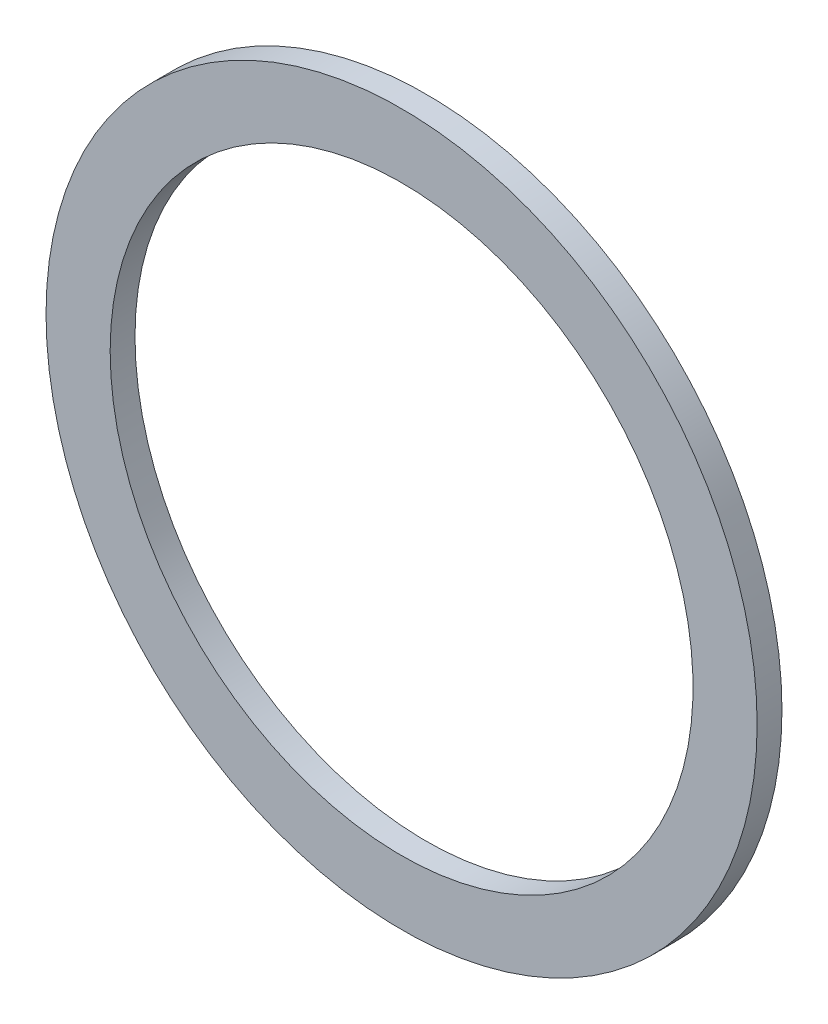
ISO-10303-21;
HEADER;
FILE_DESCRIPTION(('STEP AP214'),'2;1');
FILE_NAME('part.step','',(''),(''),'','','');
FILE_SCHEMA(('AUTOMOTIVE_DESIGN { 1 0 10303 214 1 1 1 1 }'));
ENDSEC;
DATA;
#1=APPLICATION_CONTEXT('core data for automotive mechanical design processes');
#2=APPLICATION_PROTOCOL_DEFINITION('international standard','automotive_design',2000,#1);
#3=PRODUCT_CONTEXT('',#1,'mechanical');
#4=PRODUCT('Part','Part','',(#3));
#5=PRODUCT_RELATED_PRODUCT_CATEGORY('part','',(#4));
#6=PRODUCT_DEFINITION_FORMATION('','',#4);
#7=PRODUCT_DEFINITION_CONTEXT('part definition',#1,'design');
#8=PRODUCT_DEFINITION('design','',#6,#7);
#9=PRODUCT_DEFINITION_SHAPE('','',#8);
#10=(LENGTH_UNIT() NAMED_UNIT(*) SI_UNIT(.MILLI.,.METRE.));
#11=(NAMED_UNIT(*) PLANE_ANGLE_UNIT() SI_UNIT($,.RADIAN.));
#12=(NAMED_UNIT(*) SI_UNIT($,.STERADIAN.) SOLID_ANGLE_UNIT());
#13=UNCERTAINTY_MEASURE_WITH_UNIT(LENGTH_MEASURE(1.E-05),#10,'distance_accuracy_value','');
#14=(GEOMETRIC_REPRESENTATION_CONTEXT(3) GLOBAL_UNCERTAINTY_ASSIGNED_CONTEXT((#13)) GLOBAL_UNIT_ASSIGNED_CONTEXT((#10,
#11,#12)) REPRESENTATION_CONTEXT('',''));
#15=CARTESIAN_POINT('',(0.,0.,0.));
#16=DIRECTION('',(0.,0.,1.));
#17=DIRECTION('',(1.,0.,0.));
#18=AXIS2_PLACEMENT_3D('',#15,#16,#17);
#19=CARTESIAN_POINT('',(0.,0.,0.));
#20=DIRECTION('',(0.,0.,-1.));
#21=DIRECTION('',(-1.,0.,0.));
#22=AXIS2_PLACEMENT_3D('',#19,#20,#21);
#23=PLANE('',#22);
#24=CARTESIAN_POINT('',(0.,0.,0.));
#25=DIRECTION('',(0.,0.,-1.));
#26=DIRECTION('',(-1.,0.,0.));
#27=AXIS2_PLACEMENT_3D('',#24,#25,#26);
#28=CIRCLE('',#27,17.4625);
#29=CARTESIAN_POINT('',(-17.4625,0.,0.));
#30=VERTEX_POINT('',#29);
#31=EDGE_CURVE('E27',#30,#30,#28,.F.);
#32=ORIENTED_EDGE('',*,*,#31,.F.);
#33=EDGE_LOOP('',(#32));
#34=FACE_BOUND('',#33,.T.);
#35=CARTESIAN_POINT('',(0.,0.,0.));
#36=DIRECTION('',(0.,0.,-1.));
#37=DIRECTION('',(-1.,0.,0.));
#38=AXIS2_PLACEMENT_3D('',#35,#36,#37);
#39=CIRCLE('',#38,14.3129);
#40=CARTESIAN_POINT('',(-14.3129,0.,0.));
#41=VERTEX_POINT('',#40);
#42=EDGE_CURVE('E18',#41,#41,#39,.F.);
#43=ORIENTED_EDGE('',*,*,#42,.T.);
#44=EDGE_LOOP('',(#43));
#45=FACE_BOUND('',#44,.T.);
#46=ADVANCED_FACE('F15',(#34,#45),#23,.T.);
#47=CARTESIAN_POINT('',(0.,0.,1.2192));
#48=DIRECTION('',(0.,0.,-1.));
#49=DIRECTION('',(-1.,0.,0.));
#50=AXIS2_PLACEMENT_3D('',#47,#48,#49);
#51=CYLINDRICAL_SURFACE('',#50,14.3129);
#52=ORIENTED_EDGE('',*,*,#42,.F.);
#53=EDGE_LOOP('',(#52));
#54=FACE_BOUND('',#53,.T.);
#55=CARTESIAN_POINT('',(0.,0.,1.2192));
#56=DIRECTION('',(0.,0.,-1.));
#57=DIRECTION('',(-1.,0.,0.));
#58=AXIS2_PLACEMENT_3D('',#55,#56,#57);
#59=CIRCLE('',#58,14.3129);
#60=CARTESIAN_POINT('',(-14.3129,0.,1.2192));
#61=VERTEX_POINT('',#60);
#62=EDGE_CURVE('E22',#61,#61,#59,.F.);
#63=ORIENTED_EDGE('',*,*,#62,.T.);
#64=EDGE_LOOP('',(#63));
#65=FACE_BOUND('',#64,.T.);
#66=ADVANCED_FACE('F36',(#54,#65),#51,.F.);
#67=CARTESIAN_POINT('',(0.,0.,1.2192));
#68=DIRECTION('',(0.,0.,-1.));
#69=DIRECTION('',(-1.,0.,0.));
#70=AXIS2_PLACEMENT_3D('',#67,#68,#69);
#71=CYLINDRICAL_SURFACE('',#70,17.4625);
#72=ORIENTED_EDGE('',*,*,#31,.T.);
#73=EDGE_LOOP('',(#72));
#74=FACE_BOUND('',#73,.T.);
#75=CARTESIAN_POINT('',(0.,0.,1.2192));
#76=DIRECTION('',(0.,0.,-1.));
#77=DIRECTION('',(-1.,0.,0.));
#78=AXIS2_PLACEMENT_3D('',#75,#76,#77);
#79=CIRCLE('',#78,17.4625);
#80=CARTESIAN_POINT('',(-17.4625,0.,1.2192));
#81=VERTEX_POINT('',#80);
#82=EDGE_CURVE('E10',#81,#81,#79,.T.);
#83=ORIENTED_EDGE('',*,*,#82,.T.);
#84=EDGE_LOOP('',(#83));
#85=FACE_BOUND('',#84,.T.);
#86=ADVANCED_FACE('F39',(#74,#85),#71,.T.);
#87=CARTESIAN_POINT('',(0.,0.,1.2192));
#88=DIRECTION('',(0.,0.,-1.));
#89=DIRECTION('',(-1.,0.,0.));
#90=AXIS2_PLACEMENT_3D('',#87,#88,#89);
#91=PLANE('',#90);
#92=ORIENTED_EDGE('',*,*,#82,.F.);
#93=EDGE_LOOP('',(#92));
#94=FACE_BOUND('',#93,.T.);
#95=ORIENTED_EDGE('',*,*,#62,.F.);
#96=EDGE_LOOP('',(#95));
#97=FACE_BOUND('',#96,.T.);
#98=ADVANCED_FACE('F42',(#94,#97),#91,.F.);
#99=CLOSED_SHELL('',(#46,#66,#86,#98));
#100=MANIFOLD_SOLID_BREP('B1',#99);
#101=ADVANCED_BREP_SHAPE_REPRESENTATION('',(#18,#100),#14);
#102=SHAPE_DEFINITION_REPRESENTATION(#9,#101);
ENDSEC;
END-ISO-10303-21;
